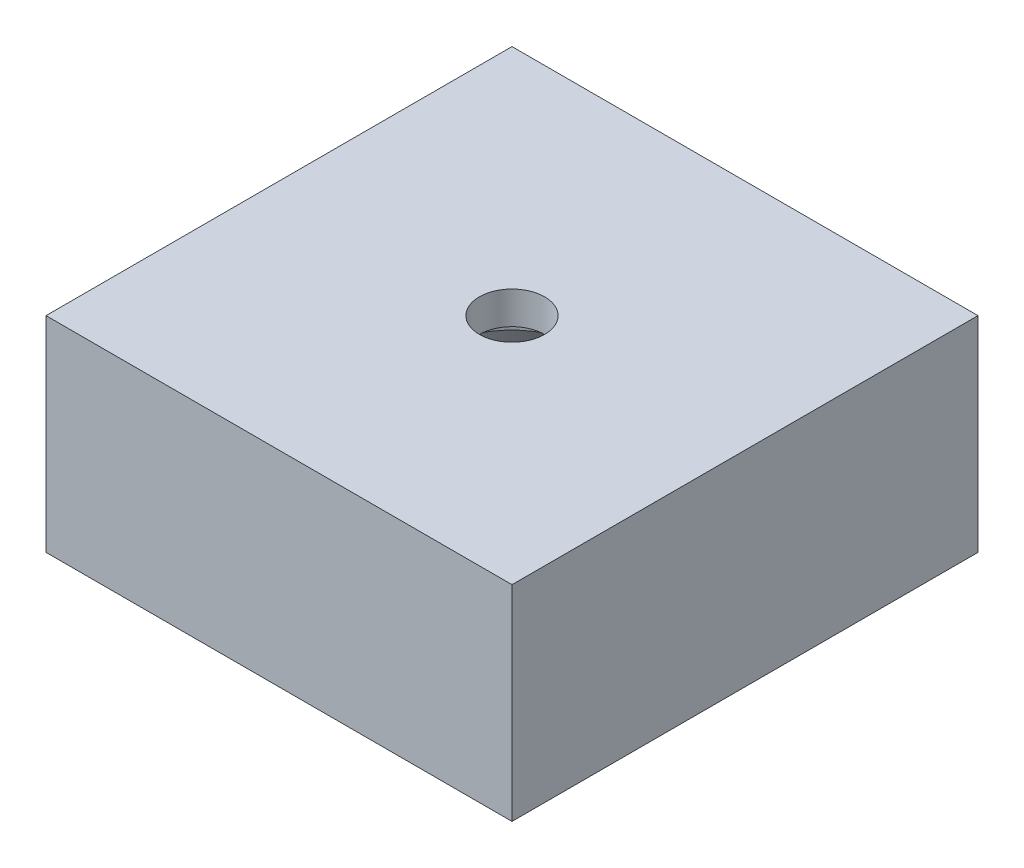
ISO-10303-21;
HEADER;
FILE_DESCRIPTION(('STEP AP214'),'2;1');
FILE_NAME('part.step','',(''),(''),'','','');
FILE_SCHEMA(('AUTOMOTIVE_DESIGN { 1 0 10303 214 1 1 1 1 }'));
ENDSEC;
DATA;
#1=APPLICATION_CONTEXT('core data for automotive mechanical design processes');
#2=APPLICATION_PROTOCOL_DEFINITION('international standard','automotive_design',2000,#1);
#3=PRODUCT_CONTEXT('',#1,'mechanical');
#4=PRODUCT('Part','Part','',(#3));
#5=PRODUCT_RELATED_PRODUCT_CATEGORY('part','',(#4));
#6=PRODUCT_DEFINITION_FORMATION('','',#4);
#7=PRODUCT_DEFINITION_CONTEXT('part definition',#1,'design');
#8=PRODUCT_DEFINITION('design','',#6,#7);
#9=PRODUCT_DEFINITION_SHAPE('','',#8);
#10=(LENGTH_UNIT() NAMED_UNIT(*) SI_UNIT(.MILLI.,.METRE.));
#11=(NAMED_UNIT(*) PLANE_ANGLE_UNIT() SI_UNIT($,.RADIAN.));
#12=(NAMED_UNIT(*) SI_UNIT($,.STERADIAN.) SOLID_ANGLE_UNIT());
#13=UNCERTAINTY_MEASURE_WITH_UNIT(LENGTH_MEASURE(1.E-05),#10,'distance_accuracy_value','');
#14=(GEOMETRIC_REPRESENTATION_CONTEXT(3) GLOBAL_UNCERTAINTY_ASSIGNED_CONTEXT((#13)) GLOBAL_UNIT_ASSIGNED_CONTEXT((#10,
#11,#12)) REPRESENTATION_CONTEXT('',''));
#15=CARTESIAN_POINT('',(0.,0.,0.));
#16=DIRECTION('',(0.,0.,1.));
#17=DIRECTION('',(1.,0.,0.));
#18=AXIS2_PLACEMENT_3D('',#15,#16,#17);
#19=CARTESIAN_POINT('',(-25.,-11.,-25.));
#20=DIRECTION('',(-1.,0.,0.));
#21=DIRECTION('',(0.,0.,1.));
#22=AXIS2_PLACEMENT_3D('',#19,#20,#21);
#23=PLANE('',#22);
#24=DIRECTION('',(0.,1.,0.));
#25=VECTOR('',#24,1.);
#26=CARTESIAN_POINT('',(-25.,-11.,25.));
#27=LINE('',#26,#25);
#28=CARTESIAN_POINT('',(-25.,-11.,25.));
#29=VERTEX_POINT('',#28);
#30=CARTESIAN_POINT('',(-25.,11.,25.));
#31=VERTEX_POINT('',#30);
#32=EDGE_CURVE('E36',#29,#31,#27,.T.);
#33=ORIENTED_EDGE('',*,*,#32,.T.);
#34=DIRECTION('',(0.,0.,1.));
#35=VECTOR('',#34,1.);
#36=CARTESIAN_POINT('',(-25.,11.,-25.));
#37=LINE('',#36,#35);
#38=CARTESIAN_POINT('',(-25.,11.,-25.));
#39=VERTEX_POINT('',#38);
#40=EDGE_CURVE('E73',#39,#31,#37,.T.);
#41=ORIENTED_EDGE('',*,*,#40,.F.);
#42=DIRECTION('',(0.,1.,0.));
#43=VECTOR('',#42,1.);
#44=CARTESIAN_POINT('',(-25.,-11.,-25.));
#45=LINE('',#44,#43);
#46=CARTESIAN_POINT('',(-25.,-11.,-25.));
#47=VERTEX_POINT('',#46);
#48=EDGE_CURVE('E11',#47,#39,#45,.T.);
#49=ORIENTED_EDGE('',*,*,#48,.F.);
#50=DIRECTION('',(0.,0.,1.));
#51=VECTOR('',#50,1.);
#52=CARTESIAN_POINT('',(-25.,-11.,-25.));
#53=LINE('',#52,#51);
#54=EDGE_CURVE('E74',#47,#29,#53,.T.);
#55=ORIENTED_EDGE('',*,*,#54,.T.);
#56=EDGE_LOOP('',(#33,#41,#49,#55));
#57=FACE_BOUND('',#56,.T.);
#58=ADVANCED_FACE('F33',(#57),#23,.T.);
#59=CARTESIAN_POINT('',(-25.,-11.,-25.));
#60=DIRECTION('',(0.,0.,-1.));
#61=DIRECTION('',(-1.,0.,0.));
#62=AXIS2_PLACEMENT_3D('',#59,#60,#61);
#63=PLANE('',#62);
#64=ORIENTED_EDGE('',*,*,#48,.T.);
#65=DIRECTION('',(-1.,0.,0.));
#66=VECTOR('',#65,1.);
#67=CARTESIAN_POINT('',(-25.,11.,-25.));
#68=LINE('',#67,#66);
#69=CARTESIAN_POINT('',(25.,11.,-25.));
#70=VERTEX_POINT('',#69);
#71=EDGE_CURVE('E90',#70,#39,#68,.T.);
#72=ORIENTED_EDGE('',*,*,#71,.F.);
#73=DIRECTION('',(0.,1.,0.));
#74=VECTOR('',#73,1.);
#75=CARTESIAN_POINT('',(25.,-11.,-25.));
#76=LINE('',#75,#74);
#77=CARTESIAN_POINT('',(25.,-11.,-25.));
#78=VERTEX_POINT('',#77);
#79=EDGE_CURVE('E41',#78,#70,#76,.T.);
#80=ORIENTED_EDGE('',*,*,#79,.F.);
#81=DIRECTION('',(-1.,0.,0.));
#82=VECTOR('',#81,1.);
#83=CARTESIAN_POINT('',(-25.,-11.,-25.));
#84=LINE('',#83,#82);
#85=EDGE_CURVE('E79',#78,#47,#84,.T.);
#86=ORIENTED_EDGE('',*,*,#85,.T.);
#87=EDGE_LOOP('',(#64,#72,#80,#86));
#88=FACE_BOUND('',#87,.T.);
#89=ADVANCED_FACE('F110',(#88),#63,.T.);
#90=CARTESIAN_POINT('',(25.,-11.,-25.));
#91=DIRECTION('',(1.,0.,0.));
#92=DIRECTION('',(0.,0.,-1.));
#93=AXIS2_PLACEMENT_3D('',#90,#91,#92);
#94=PLANE('',#93);
#95=ORIENTED_EDGE('',*,*,#79,.T.);
#96=DIRECTION('',(0.,0.,-1.));
#97=VECTOR('',#96,1.);
#98=CARTESIAN_POINT('',(25.,11.,-25.));
#99=LINE('',#98,#97);
#100=CARTESIAN_POINT('',(25.,11.,25.));
#101=VERTEX_POINT('',#100);
#102=EDGE_CURVE('E86',#101,#70,#99,.T.);
#103=ORIENTED_EDGE('',*,*,#102,.F.);
#104=DIRECTION('',(0.,1.,0.));
#105=VECTOR('',#104,1.);
#106=CARTESIAN_POINT('',(25.,-11.,25.));
#107=LINE('',#106,#105);
#108=CARTESIAN_POINT('',(25.,-11.,25.));
#109=VERTEX_POINT('',#108);
#110=EDGE_CURVE('E78',#109,#101,#107,.T.);
#111=ORIENTED_EDGE('',*,*,#110,.F.);
#112=DIRECTION('',(0.,0.,-1.));
#113=VECTOR('',#112,1.);
#114=CARTESIAN_POINT('',(25.,-11.,-25.));
#115=LINE('',#114,#113);
#116=EDGE_CURVE('E103',#109,#78,#115,.T.);
#117=ORIENTED_EDGE('',*,*,#116,.T.);
#118=EDGE_LOOP('',(#95,#103,#111,#117));
#119=FACE_BOUND('',#118,.T.);
#120=ADVANCED_FACE('F107',(#119),#94,.T.);
#121=CARTESIAN_POINT('',(-25.,-11.,25.));
#122=DIRECTION('',(0.,0.,1.));
#123=DIRECTION('',(1.,0.,0.));
#124=AXIS2_PLACEMENT_3D('',#121,#122,#123);
#125=PLANE('',#124);
#126=ORIENTED_EDGE('',*,*,#110,.T.);
#127=DIRECTION('',(1.,0.,0.));
#128=VECTOR('',#127,1.);
#129=CARTESIAN_POINT('',(-25.,11.,25.));
#130=LINE('',#129,#128);
#131=EDGE_CURVE('E81',#31,#101,#130,.T.);
#132=ORIENTED_EDGE('',*,*,#131,.F.);
#133=ORIENTED_EDGE('',*,*,#32,.F.);
#134=DIRECTION('',(1.,0.,0.));
#135=VECTOR('',#134,1.);
#136=CARTESIAN_POINT('',(-25.,-11.,25.));
#137=LINE('',#136,#135);
#138=EDGE_CURVE('E101',#29,#109,#137,.T.);
#139=ORIENTED_EDGE('',*,*,#138,.T.);
#140=EDGE_LOOP('',(#126,#132,#133,#139));
#141=FACE_BOUND('',#140,.T.);
#142=ADVANCED_FACE('F82',(#141),#125,.T.);
#143=CARTESIAN_POINT('',(0.,-11.,0.));
#144=DIRECTION('',(0.,1.,0.));
#145=DIRECTION('',(0.,0.,1.));
#146=AXIS2_PLACEMENT_3D('',#143,#144,#145);
#147=PLANE('',#146);
#148=CARTESIAN_POINT('',(0.,-11.,0.));
#149=DIRECTION('',(0.,1.,0.));
#150=DIRECTION('',(-1.,0.,0.));
#151=AXIS2_PLACEMENT_3D('',#148,#149,#150);
#152=CIRCLE('',#151,18.);
#153=CARTESIAN_POINT('',(-18.,-11.,0.));
#154=VERTEX_POINT('',#153);
#155=EDGE_CURVE('E209',#154,#154,#152,.T.);
#156=ORIENTED_EDGE('',*,*,#155,.T.);
#157=EDGE_LOOP('',(#156));
#158=FACE_BOUND('',#157,.T.);
#159=ORIENTED_EDGE('',*,*,#54,.F.);
#160=ORIENTED_EDGE('',*,*,#85,.F.);
#161=ORIENTED_EDGE('',*,*,#116,.F.);
#162=ORIENTED_EDGE('',*,*,#138,.F.);
#163=EDGE_LOOP('',(#159,#160,#161,#162));
#164=FACE_BOUND('',#163,.T.);
#165=ADVANCED_FACE('F112',(#158,#164),#147,.F.);
#166=CARTESIAN_POINT('',(0.,11.,0.));
#167=DIRECTION('',(0.,1.,0.));
#168=DIRECTION('',(0.,0.,1.));
#169=AXIS2_PLACEMENT_3D('',#166,#167,#168);
#170=PLANE('',#169);
#171=CARTESIAN_POINT('',(0.,11.,0.));
#172=DIRECTION('',(0.,1.,0.));
#173=DIRECTION('',(-1.,0.,0.));
#174=AXIS2_PLACEMENT_3D('',#171,#172,#173);
#175=CIRCLE('',#174,3.5);
#176=CARTESIAN_POINT('',(-3.5,11.,0.));
#177=VERTEX_POINT('',#176);
#178=EDGE_CURVE('E208',#177,#177,#175,.T.);
#179=ORIENTED_EDGE('',*,*,#178,.F.);
#180=EDGE_LOOP('',(#179));
#181=FACE_BOUND('',#180,.T.);
#182=ORIENTED_EDGE('',*,*,#40,.T.);
#183=ORIENTED_EDGE('',*,*,#131,.T.);
#184=ORIENTED_EDGE('',*,*,#102,.T.);
#185=ORIENTED_EDGE('',*,*,#71,.T.);
#186=EDGE_LOOP('',(#182,#183,#184,#185));
#187=FACE_BOUND('',#186,.T.);
#188=ADVANCED_FACE('F89',(#181,#187),#170,.T.);
#189=CARTESIAN_POINT('',(-8.,7.5,0.));
#190=DIRECTION('',(0.,1.,0.));
#191=DIRECTION('',(-1.,0.,0.));
#192=AXIS2_PLACEMENT_3D('',#189,#190,#191);
#193=PLANE('',#192);
#194=CARTESIAN_POINT('',(0.,7.5,0.));
#195=DIRECTION('',(0.,1.,0.));
#196=DIRECTION('',(-1.,0.,0.));
#197=AXIS2_PLACEMENT_3D('',#194,#195,#196);
#198=CIRCLE('',#197,8.);
#199=CARTESIAN_POINT('',(-8.,7.5,0.));
#200=VERTEX_POINT('',#199);
#201=EDGE_CURVE('E91',#200,#200,#198,.T.);
#202=ORIENTED_EDGE('',*,*,#201,.F.);
#203=EDGE_LOOP('',(#202));
#204=FACE_BOUND('',#203,.T.);
#205=CARTESIAN_POINT('',(0.,7.5,0.));
#206=DIRECTION('',(0.,1.,0.));
#207=DIRECTION('',(-1.,0.,0.));
#208=AXIS2_PLACEMENT_3D('',#205,#206,#207);
#209=CIRCLE('',#208,3.5);
#210=CARTESIAN_POINT('',(-3.5,7.5,0.));
#211=VERTEX_POINT('',#210);
#212=EDGE_CURVE('E205',#211,#211,#209,.T.);
#213=ORIENTED_EDGE('',*,*,#212,.T.);
#214=EDGE_LOOP('',(#213));
#215=FACE_BOUND('',#214,.T.);
#216=ADVANCED_FACE('F120',(#204,#215),#193,.F.);
#217=CARTESIAN_POINT('',(0.,11.,0.));
#218=DIRECTION('',(0.,1.,0.));
#219=DIRECTION('',(-1.,0.,0.));
#220=AXIS2_PLACEMENT_3D('',#217,#218,#219);
#221=CYLINDRICAL_SURFACE('',#220,8.);
#222=CARTESIAN_POINT('',(0.,4.,0.));
#223=DIRECTION('',(0.,1.,0.));
#224=DIRECTION('',(-1.,0.,0.));
#225=AXIS2_PLACEMENT_3D('',#222,#223,#224);
#226=CIRCLE('',#225,8.);
#227=CARTESIAN_POINT('',(-8.,4.,0.));
#228=VERTEX_POINT('',#227);
#229=EDGE_CURVE('E94',#228,#228,#226,.T.);
#230=ORIENTED_EDGE('',*,*,#229,.F.);
#231=EDGE_LOOP('',(#230));
#232=FACE_BOUND('',#231,.T.);
#233=ORIENTED_EDGE('',*,*,#201,.T.);
#234=EDGE_LOOP('',(#233));
#235=FACE_BOUND('',#234,.T.);
#236=ADVANCED_FACE('F158',(#232,#235),#221,.F.);
#237=CARTESIAN_POINT('',(-10.5,4.,0.));
#238=DIRECTION('',(0.,1.,0.));
#239=DIRECTION('',(-1.,0.,0.));
#240=AXIS2_PLACEMENT_3D('',#237,#238,#239);
#241=PLANE('',#240);
#242=CARTESIAN_POINT('',(0.,4.,0.));
#243=DIRECTION('',(0.,1.,0.));
#244=DIRECTION('',(-1.,0.,0.));
#245=AXIS2_PLACEMENT_3D('',#242,#243,#244);
#246=CIRCLE('',#245,10.5);
#247=CARTESIAN_POINT('',(-10.5,4.,0.));
#248=VERTEX_POINT('',#247);
#249=EDGE_CURVE('E211',#248,#248,#246,.T.);
#250=ORIENTED_EDGE('',*,*,#249,.F.);
#251=EDGE_LOOP('',(#250));
#252=FACE_BOUND('',#251,.T.);
#253=ORIENTED_EDGE('',*,*,#229,.T.);
#254=EDGE_LOOP('',(#253));
#255=FACE_BOUND('',#254,.T.);
#256=ADVANCED_FACE('F168',(#252,#255),#241,.F.);
#257=CARTESIAN_POINT('',(0.,4.,0.));
#258=DIRECTION('',(0.,-1.,0.));
#259=DIRECTION('',(1.,0.,0.));
#260=AXIS2_PLACEMENT_3D('',#257,#258,#259);
#261=CONICAL_SURFACE('',#260,10.5,0.463647609000806);
#262=ORIENTED_EDGE('',*,*,#155,.F.);
#263=EDGE_LOOP('',(#262));
#264=FACE_BOUND('',#263,.T.);
#265=ORIENTED_EDGE('',*,*,#249,.T.);
#266=EDGE_LOOP('',(#265));
#267=FACE_BOUND('',#266,.T.);
#268=ADVANCED_FACE('F178',(#264,#267),#261,.F.);
#269=CARTESIAN_POINT('',(0.,11.,0.));
#270=DIRECTION('',(0.,1.,0.));
#271=DIRECTION('',(-1.,0.,0.));
#272=AXIS2_PLACEMENT_3D('',#269,#270,#271);
#273=CYLINDRICAL_SURFACE('',#272,3.5);
#274=ORIENTED_EDGE('',*,*,#212,.F.);
#275=EDGE_LOOP('',(#274));
#276=FACE_BOUND('',#275,.T.);
#277=ORIENTED_EDGE('',*,*,#178,.T.);
#278=EDGE_LOOP('',(#277));
#279=FACE_BOUND('',#278,.T.);
#280=ADVANCED_FACE('F188',(#276,#279),#273,.F.);
#281=CLOSED_SHELL('',(#58,#89,#120,#142,#165,#188,#216,#236,#256,#268,#280));
#282=MANIFOLD_SOLID_BREP('B2',#281);
#283=ADVANCED_BREP_SHAPE_REPRESENTATION('',(#18,#282),#14);
#284=SHAPE_DEFINITION_REPRESENTATION(#9,#283);
ENDSEC;
END-ISO-10303-21;
